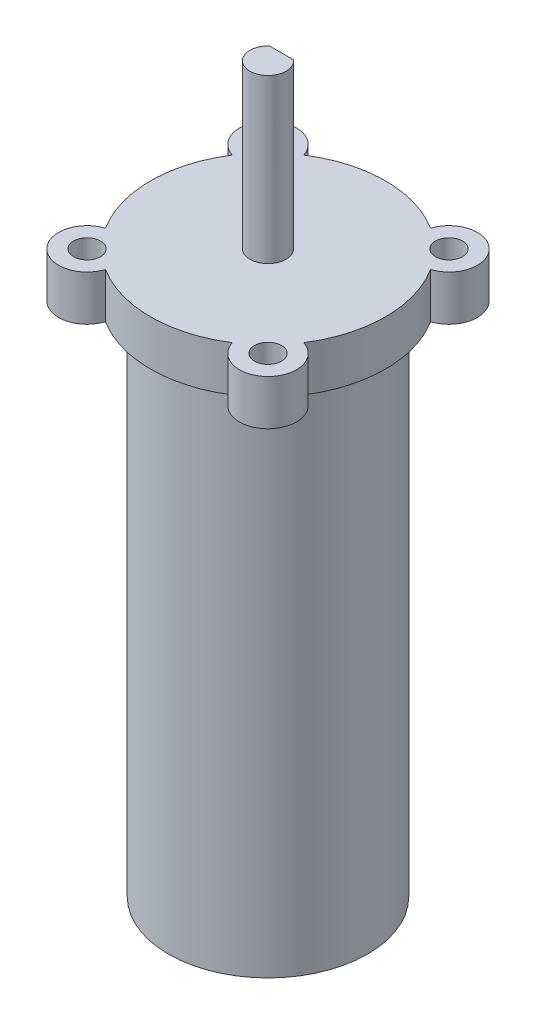
ISO-10303-21;
HEADER;
FILE_DESCRIPTION(('STEP AP214'),'2;1');
FILE_NAME('part.step','',(''),(''),'','','');
FILE_SCHEMA(('AUTOMOTIVE_DESIGN { 1 0 10303 214 1 1 1 1 }'));
ENDSEC;
DATA;
#1=APPLICATION_CONTEXT('core data for automotive mechanical design processes');
#2=APPLICATION_PROTOCOL_DEFINITION('international standard','automotive_design',2000,#1);
#3=PRODUCT_CONTEXT('',#1,'mechanical');
#4=PRODUCT('Part','Part','',(#3));
#5=PRODUCT_RELATED_PRODUCT_CATEGORY('part','',(#4));
#6=PRODUCT_DEFINITION_FORMATION('','',#4);
#7=PRODUCT_DEFINITION_CONTEXT('part definition',#1,'design');
#8=PRODUCT_DEFINITION('design','',#6,#7);
#9=PRODUCT_DEFINITION_SHAPE('','',#8);
#10=(LENGTH_UNIT() NAMED_UNIT(*) SI_UNIT(.MILLI.,.METRE.));
#11=(NAMED_UNIT(*) PLANE_ANGLE_UNIT() SI_UNIT($,.RADIAN.));
#12=(NAMED_UNIT(*) SI_UNIT($,.STERADIAN.) SOLID_ANGLE_UNIT());
#13=UNCERTAINTY_MEASURE_WITH_UNIT(LENGTH_MEASURE(1.E-05),#10,'distance_accuracy_value','');
#14=(GEOMETRIC_REPRESENTATION_CONTEXT(3) GLOBAL_UNCERTAINTY_ASSIGNED_CONTEXT((#13)) GLOBAL_UNIT_ASSIGNED_CONTEXT((#10,
#11,#12)) REPRESENTATION_CONTEXT('',''));
#15=CARTESIAN_POINT('',(0.,0.,0.));
#16=DIRECTION('',(0.,0.,1.));
#17=DIRECTION('',(1.,0.,0.));
#18=AXIS2_PLACEMENT_3D('',#15,#16,#17);
#19=CARTESIAN_POINT('',(0.,62.,0.));
#20=DIRECTION('',(0.,1.,0.));
#21=DIRECTION('',(0.,0.,1.));
#22=AXIS2_PLACEMENT_3D('',#19,#20,#21);
#23=PLANE('',#22);
#24=CARTESIAN_POINT('',(0.,62.,0.));
#25=DIRECTION('',(0.,1.,0.));
#26=DIRECTION('',(0.,0.,1.));
#27=AXIS2_PLACEMENT_3D('',#24,#25,#26);
#28=CIRCLE('',#27,2.);
#29=CARTESIAN_POINT('',(0.,62.,2.));
#30=VERTEX_POINT('',#29);
#31=EDGE_CURVE('E49',#30,#30,#28,.T.);
#32=ORIENTED_EDGE('',*,*,#31,.F.);
#33=EDGE_LOOP('',(#32));
#34=FACE_BOUND('',#33,.T.);
#35=CARTESIAN_POINT('',(0.,62.,0.));
#36=DIRECTION('',(0.,1.,0.));
#37=DIRECTION('',(0.,0.,1.));
#38=AXIS2_PLACEMENT_3D('',#35,#36,#37);
#39=CIRCLE('',#38,13.);
#40=CARTESIAN_POINT('',(-7.00526279150712,62.,-10.9510863945969));
#41=VERTEX_POINT('',#40);
#42=CARTESIAN_POINT('',(7.00526279150712,62.,-10.9510863945969));
#43=VERTEX_POINT('',#42);
#44=EDGE_CURVE('E167',#41,#43,#39,.F.);
#45=ORIENTED_EDGE('',*,*,#44,.F.);
#46=CARTESIAN_POINT('',(-10.,62.,-10.));
#47=DIRECTION('',(0.,1.,0.));
#48=DIRECTION('',(0.,0.,1.));
#49=AXIS2_PLACEMENT_3D('',#46,#47,#48);
#50=CIRCLE('',#49,3.14213562373095);
#51=CARTESIAN_POINT('',(-10.9510863945969,62.,-7.00526279150712));
#52=VERTEX_POINT('',#51);
#53=EDGE_CURVE('E188',#52,#41,#50,.F.);
#54=ORIENTED_EDGE('',*,*,#53,.F.);
#55=CARTESIAN_POINT('',(0.,62.,0.));
#56=DIRECTION('',(0.,1.,0.));
#57=DIRECTION('',(0.,0.,1.));
#58=AXIS2_PLACEMENT_3D('',#55,#56,#57);
#59=CIRCLE('',#58,13.);
#60=CARTESIAN_POINT('',(-10.9510863945969,62.,7.00526279150712));
#61=VERTEX_POINT('',#60);
#62=EDGE_CURVE('E192',#61,#52,#59,.F.);
#63=ORIENTED_EDGE('',*,*,#62,.F.);
#64=CARTESIAN_POINT('',(-10.,62.,9.99999999999999));
#65=DIRECTION('',(0.,1.,0.));
#66=DIRECTION('',(0.,0.,1.));
#67=AXIS2_PLACEMENT_3D('',#64,#65,#66);
#68=CIRCLE('',#67,3.14213562373094);
#69=CARTESIAN_POINT('',(-7.00526279150713,62.,10.9510863945969));
#70=VERTEX_POINT('',#69);
#71=EDGE_CURVE('E196',#70,#61,#68,.F.);
#72=ORIENTED_EDGE('',*,*,#71,.F.);
#73=CARTESIAN_POINT('',(0.,62.,0.));
#74=DIRECTION('',(0.,1.,0.));
#75=DIRECTION('',(0.,0.,1.));
#76=AXIS2_PLACEMENT_3D('',#73,#74,#75);
#77=CIRCLE('',#76,13.);
#78=CARTESIAN_POINT('',(7.00526279150713,62.,10.9510863945969));
#79=VERTEX_POINT('',#78);
#80=EDGE_CURVE('E200',#79,#70,#77,.F.);
#81=ORIENTED_EDGE('',*,*,#80,.F.);
#82=CARTESIAN_POINT('',(10.,62.,10.));
#83=DIRECTION('',(0.,1.,0.));
#84=DIRECTION('',(0.,0.,1.));
#85=AXIS2_PLACEMENT_3D('',#82,#83,#84);
#86=CIRCLE('',#85,3.14213562373095);
#87=CARTESIAN_POINT('',(10.9510863945969,62.,7.00526279150712));
#88=VERTEX_POINT('',#87);
#89=EDGE_CURVE('E204',#88,#79,#86,.F.);
#90=ORIENTED_EDGE('',*,*,#89,.F.);
#91=CARTESIAN_POINT('',(0.,62.,0.));
#92=DIRECTION('',(0.,1.,0.));
#93=DIRECTION('',(0.,0.,1.));
#94=AXIS2_PLACEMENT_3D('',#91,#92,#93);
#95=CIRCLE('',#94,13.);
#96=CARTESIAN_POINT('',(10.9510863945969,62.,-7.00526279150712));
#97=VERTEX_POINT('',#96);
#98=EDGE_CURVE('E208',#97,#88,#95,.F.);
#99=ORIENTED_EDGE('',*,*,#98,.F.);
#100=CARTESIAN_POINT('',(10.,62.,-10.));
#101=DIRECTION('',(0.,1.,0.));
#102=DIRECTION('',(0.,0.,1.));
#103=AXIS2_PLACEMENT_3D('',#100,#101,#102);
#104=CIRCLE('',#103,3.14213562373096);
#105=EDGE_CURVE('E181',#43,#97,#104,.F.);
#106=ORIENTED_EDGE('',*,*,#105,.F.);
#107=EDGE_LOOP('',(#45,#54,#63,#72,#81,#90,#99,#106));
#108=FACE_BOUND('',#107,.T.);
#109=CARTESIAN_POINT('',(10.,62.,10.));
#110=DIRECTION('',(0.,1.,0.));
#111=DIRECTION('',(0.,0.,1.));
#112=AXIS2_PLACEMENT_3D('',#109,#110,#111);
#113=CIRCLE('',#112,1.5);
#114=CARTESIAN_POINT('',(10.,62.,11.5));
#115=VERTEX_POINT('',#114);
#116=EDGE_CURVE('E177',#115,#115,#113,.F.);
#117=ORIENTED_EDGE('',*,*,#116,.T.);
#118=EDGE_LOOP('',(#117));
#119=FACE_BOUND('',#118,.T.);
#120=CARTESIAN_POINT('',(-10.,62.,-10.));
#121=DIRECTION('',(0.,1.,0.));
#122=DIRECTION('',(0.,0.,1.));
#123=AXIS2_PLACEMENT_3D('',#120,#121,#122);
#124=CIRCLE('',#123,1.5);
#125=CARTESIAN_POINT('',(-10.,62.,-8.5));
#126=VERTEX_POINT('',#125);
#127=EDGE_CURVE('E174',#126,#126,#124,.F.);
#128=ORIENTED_EDGE('',*,*,#127,.T.);
#129=EDGE_LOOP('',(#128));
#130=FACE_BOUND('',#129,.T.);
#131=CARTESIAN_POINT('',(-10.,62.,9.99999999999999));
#132=DIRECTION('',(0.,1.,0.));
#133=DIRECTION('',(0.,0.,1.));
#134=AXIS2_PLACEMENT_3D('',#131,#132,#133);
#135=CIRCLE('',#134,1.5);
#136=CARTESIAN_POINT('',(-10.,62.,11.5));
#137=VERTEX_POINT('',#136);
#138=EDGE_CURVE('E171',#137,#137,#135,.F.);
#139=ORIENTED_EDGE('',*,*,#138,.T.);
#140=EDGE_LOOP('',(#139));
#141=FACE_BOUND('',#140,.T.);
#142=CARTESIAN_POINT('',(10.,62.,-10.));
#143=DIRECTION('',(0.,1.,0.));
#144=DIRECTION('',(0.,0.,1.));
#145=AXIS2_PLACEMENT_3D('',#142,#143,#144);
#146=CIRCLE('',#145,1.5);
#147=CARTESIAN_POINT('',(10.,62.,-8.5));
#148=VERTEX_POINT('',#147);
#149=EDGE_CURVE('E168',#148,#148,#146,.F.);
#150=ORIENTED_EDGE('',*,*,#149,.T.);
#151=EDGE_LOOP('',(#150));
#152=FACE_BOUND('',#151,.T.);
#153=ADVANCED_FACE('F40',(#34,#108,#119,#130,#141,#152),#23,.T.);
#154=CARTESIAN_POINT('',(0.,80.,0.));
#155=DIRECTION('',(0.,-1.,0.));
#156=DIRECTION('',(0.,0.,-1.));
#157=AXIS2_PLACEMENT_3D('',#154,#155,#156);
#158=CYLINDRICAL_SURFACE('',#157,2.);
#159=CARTESIAN_POINT('',(0.,80.,0.));
#160=DIRECTION('',(0.,1.,0.));
#161=DIRECTION('',(0.,0.,1.));
#162=AXIS2_PLACEMENT_3D('',#159,#160,#161);
#163=CIRCLE('',#162,2.);
#164=CARTESIAN_POINT('',(-1.3228756555323,80.,-1.5));
#165=VERTEX_POINT('',#164);
#166=CARTESIAN_POINT('',(1.3228756555323,80.,-1.5));
#167=VERTEX_POINT('',#166);
#168=EDGE_CURVE('E12',#165,#167,#163,.T.);
#169=ORIENTED_EDGE('',*,*,#168,.F.);
#170=DIRECTION('',(0.,1.,0.));
#171=VECTOR('',#170,1.);
#172=CARTESIAN_POINT('',(-1.3228756555323,68.,-1.5));
#173=LINE('',#172,#171);
#174=CARTESIAN_POINT('',(-1.3228756555323,68.,-1.5));
#175=VERTEX_POINT('',#174);
#176=EDGE_CURVE('E57',#175,#165,#173,.T.);
#177=ORIENTED_EDGE('',*,*,#176,.F.);
#178=CARTESIAN_POINT('',(0.,68.,0.));
#179=DIRECTION('',(0.,1.,0.));
#180=DIRECTION('',(0.,0.,1.));
#181=AXIS2_PLACEMENT_3D('',#178,#179,#180);
#182=CIRCLE('',#181,2.);
#183=CARTESIAN_POINT('',(1.3228756555323,68.,-1.5));
#184=VERTEX_POINT('',#183);
#185=EDGE_CURVE('E120',#184,#175,#182,.T.);
#186=ORIENTED_EDGE('',*,*,#185,.F.);
#187=DIRECTION('',(0.,1.,0.));
#188=VECTOR('',#187,1.);
#189=CARTESIAN_POINT('',(1.3228756555323,68.,-1.5));
#190=LINE('',#189,#188);
#191=EDGE_CURVE('E128',#184,#167,#190,.T.);
#192=ORIENTED_EDGE('',*,*,#191,.T.);
#193=EDGE_LOOP('',(#169,#177,#186,#192));
#194=FACE_BOUND('',#193,.T.);
#195=ORIENTED_EDGE('',*,*,#31,.T.);
#196=EDGE_LOOP('',(#195));
#197=FACE_BOUND('',#196,.T.);
#198=ADVANCED_FACE('F131',(#194,#197),#158,.T.);
#199=CARTESIAN_POINT('',(0.,80.,0.));
#200=DIRECTION('',(0.,1.,0.));
#201=DIRECTION('',(0.,0.,1.));
#202=AXIS2_PLACEMENT_3D('',#199,#200,#201);
#203=PLANE('',#202);
#204=DIRECTION('',(1.,0.,0.));
#205=VECTOR('',#204,1.);
#206=CARTESIAN_POINT('',(-1.3228756555323,80.,-1.5));
#207=LINE('',#206,#205);
#208=EDGE_CURVE('E125',#165,#167,#207,.T.);
#209=ORIENTED_EDGE('',*,*,#208,.F.);
#210=ORIENTED_EDGE('',*,*,#168,.T.);
#211=EDGE_LOOP('',(#209,#210));
#212=FACE_BOUND('',#211,.T.);
#213=ADVANCED_FACE('F269',(#212),#203,.T.);
#214=CARTESIAN_POINT('',(0.,99.1715728752538,0.));
#215=DIRECTION('',(0.,-1.,0.));
#216=DIRECTION('',(0.,0.,-1.));
#217=AXIS2_PLACEMENT_3D('',#214,#215,#216);
#218=CYLINDRICAL_SURFACE('',#217,13.);
#219=CARTESIAN_POINT('',(0.,57.,0.));
#220=DIRECTION('',(0.,1.,0.));
#221=DIRECTION('',(0.,0.,1.));
#222=AXIS2_PLACEMENT_3D('',#219,#220,#221);
#223=CIRCLE('',#222,13.);
#224=CARTESIAN_POINT('',(-7.00526279150712,57.,-10.9510863945969));
#225=VERTEX_POINT('',#224);
#226=CARTESIAN_POINT('',(7.00526279150712,57.,-10.9510863945969));
#227=VERTEX_POINT('',#226);
#228=EDGE_CURVE('E65',#225,#227,#223,.F.);
#229=ORIENTED_EDGE('',*,*,#228,.F.);
#230=DIRECTION('',(0.,-1.,0.));
#231=VECTOR('',#230,1.);
#232=CARTESIAN_POINT('',(-7.00526279150712,99.1715728752538,-10.9510863945969));
#233=LINE('',#232,#231);
#234=EDGE_CURVE('E191',#41,#225,#233,.T.);
#235=ORIENTED_EDGE('',*,*,#234,.F.);
#236=ORIENTED_EDGE('',*,*,#44,.T.);
#237=DIRECTION('',(0.,-1.,0.));
#238=VECTOR('',#237,1.);
#239=CARTESIAN_POINT('',(7.00526279150712,99.1715728752538,-10.9510863945969));
#240=LINE('',#239,#238);
#241=EDGE_CURVE('E187',#43,#227,#240,.T.);
#242=ORIENTED_EDGE('',*,*,#241,.T.);
#243=EDGE_LOOP('',(#229,#235,#236,#242));
#244=FACE_BOUND('',#243,.T.);
#245=ADVANCED_FACE('F258',(#244),#218,.T.);
#246=CARTESIAN_POINT('',(-10.,99.1715728752538,-10.));
#247=DIRECTION('',(0.,-1.,0.));
#248=DIRECTION('',(0.,0.,-1.));
#249=AXIS2_PLACEMENT_3D('',#246,#247,#248);
#250=CYLINDRICAL_SURFACE('',#249,3.14213562373095);
#251=CARTESIAN_POINT('',(-10.,57.,-10.));
#252=DIRECTION('',(0.,1.,0.));
#253=DIRECTION('',(0.,0.,1.));
#254=AXIS2_PLACEMENT_3D('',#251,#252,#253);
#255=CIRCLE('',#254,3.14213562373095);
#256=CARTESIAN_POINT('',(-10.9510863945969,57.,-7.00526279150712));
#257=VERTEX_POINT('',#256);
#258=EDGE_CURVE('E164',#257,#225,#255,.F.);
#259=ORIENTED_EDGE('',*,*,#258,.F.);
#260=DIRECTION('',(0.,-1.,0.));
#261=VECTOR('',#260,1.);
#262=CARTESIAN_POINT('',(-10.9510863945969,99.1715728752538,-7.00526279150712));
#263=LINE('',#262,#261);
#264=EDGE_CURVE('E195',#52,#257,#263,.T.);
#265=ORIENTED_EDGE('',*,*,#264,.F.);
#266=ORIENTED_EDGE('',*,*,#53,.T.);
#267=ORIENTED_EDGE('',*,*,#234,.T.);
#268=EDGE_LOOP('',(#259,#265,#266,#267));
#269=FACE_BOUND('',#268,.T.);
#270=ADVANCED_FACE('F290',(#269),#250,.T.);
#271=CARTESIAN_POINT('',(0.,99.1715728752538,0.));
#272=DIRECTION('',(0.,-1.,0.));
#273=DIRECTION('',(0.,0.,-1.));
#274=AXIS2_PLACEMENT_3D('',#271,#272,#273);
#275=CYLINDRICAL_SURFACE('',#274,13.);
#276=CARTESIAN_POINT('',(0.,57.,0.));
#277=DIRECTION('',(0.,1.,0.));
#278=DIRECTION('',(0.,0.,1.));
#279=AXIS2_PLACEMENT_3D('',#276,#277,#278);
#280=CIRCLE('',#279,13.);
#281=CARTESIAN_POINT('',(-10.9510863945969,57.,7.00526279150712));
#282=VERTEX_POINT('',#281);
#283=EDGE_CURVE('E162',#282,#257,#280,.F.);
#284=ORIENTED_EDGE('',*,*,#283,.F.);
#285=DIRECTION('',(0.,-1.,0.));
#286=VECTOR('',#285,1.);
#287=CARTESIAN_POINT('',(-10.9510863945969,99.1715728752538,7.00526279150712));
#288=LINE('',#287,#286);
#289=EDGE_CURVE('E199',#61,#282,#288,.T.);
#290=ORIENTED_EDGE('',*,*,#289,.F.);
#291=ORIENTED_EDGE('',*,*,#62,.T.);
#292=ORIENTED_EDGE('',*,*,#264,.T.);
#293=EDGE_LOOP('',(#284,#290,#291,#292));
#294=FACE_BOUND('',#293,.T.);
#295=ADVANCED_FACE('F297',(#294),#275,.T.);
#296=CARTESIAN_POINT('',(-10.,99.1715728752538,9.99999999999999));
#297=DIRECTION('',(0.,-1.,0.));
#298=DIRECTION('',(0.,0.,-1.));
#299=AXIS2_PLACEMENT_3D('',#296,#297,#298);
#300=CYLINDRICAL_SURFACE('',#299,3.14213562373094);
#301=CARTESIAN_POINT('',(-10.,57.,9.99999999999999));
#302=DIRECTION('',(0.,1.,0.));
#303=DIRECTION('',(0.,0.,1.));
#304=AXIS2_PLACEMENT_3D('',#301,#302,#303);
#305=CIRCLE('',#304,3.14213562373094);
#306=CARTESIAN_POINT('',(-7.00526279150713,57.,10.9510863945969));
#307=VERTEX_POINT('',#306);
#308=EDGE_CURVE('E160',#307,#282,#305,.F.);
#309=ORIENTED_EDGE('',*,*,#308,.F.);
#310=DIRECTION('',(0.,-1.,0.));
#311=VECTOR('',#310,1.);
#312=CARTESIAN_POINT('',(-7.00526279150713,99.1715728752538,10.9510863945969));
#313=LINE('',#312,#311);
#314=EDGE_CURVE('E203',#70,#307,#313,.T.);
#315=ORIENTED_EDGE('',*,*,#314,.F.);
#316=ORIENTED_EDGE('',*,*,#71,.T.);
#317=ORIENTED_EDGE('',*,*,#289,.T.);
#318=EDGE_LOOP('',(#309,#315,#316,#317));
#319=FACE_BOUND('',#318,.T.);
#320=ADVANCED_FACE('F304',(#319),#300,.T.);
#321=CARTESIAN_POINT('',(0.,99.1715728752538,0.));
#322=DIRECTION('',(0.,-1.,0.));
#323=DIRECTION('',(0.,0.,-1.));
#324=AXIS2_PLACEMENT_3D('',#321,#322,#323);
#325=CYLINDRICAL_SURFACE('',#324,13.);
#326=CARTESIAN_POINT('',(0.,57.,0.));
#327=DIRECTION('',(0.,1.,0.));
#328=DIRECTION('',(0.,0.,1.));
#329=AXIS2_PLACEMENT_3D('',#326,#327,#328);
#330=CIRCLE('',#329,13.);
#331=CARTESIAN_POINT('',(7.00526279150713,57.,10.9510863945969));
#332=VERTEX_POINT('',#331);
#333=EDGE_CURVE('E158',#332,#307,#330,.F.);
#334=ORIENTED_EDGE('',*,*,#333,.F.);
#335=DIRECTION('',(0.,-1.,0.));
#336=VECTOR('',#335,1.);
#337=CARTESIAN_POINT('',(7.00526279150713,99.1715728752538,10.9510863945969));
#338=LINE('',#337,#336);
#339=EDGE_CURVE('E207',#79,#332,#338,.T.);
#340=ORIENTED_EDGE('',*,*,#339,.F.);
#341=ORIENTED_EDGE('',*,*,#80,.T.);
#342=ORIENTED_EDGE('',*,*,#314,.T.);
#343=EDGE_LOOP('',(#334,#340,#341,#342));
#344=FACE_BOUND('',#343,.T.);
#345=ADVANCED_FACE('F312',(#344),#325,.T.);
#346=CARTESIAN_POINT('',(10.,99.1715728752538,10.));
#347=DIRECTION('',(0.,-1.,0.));
#348=DIRECTION('',(0.,0.,-1.));
#349=AXIS2_PLACEMENT_3D('',#346,#347,#348);
#350=CYLINDRICAL_SURFACE('',#349,3.14213562373095);
#351=CARTESIAN_POINT('',(10.,57.,10.));
#352=DIRECTION('',(0.,1.,0.));
#353=DIRECTION('',(0.,0.,1.));
#354=AXIS2_PLACEMENT_3D('',#351,#352,#353);
#355=CIRCLE('',#354,3.14213562373095);
#356=CARTESIAN_POINT('',(10.9510863945969,57.,7.00526279150712));
#357=VERTEX_POINT('',#356);
#358=EDGE_CURVE('E156',#357,#332,#355,.F.);
#359=ORIENTED_EDGE('',*,*,#358,.F.);
#360=DIRECTION('',(0.,-1.,0.));
#361=VECTOR('',#360,1.);
#362=CARTESIAN_POINT('',(10.9510863945969,99.1715728752538,7.00526279150712));
#363=LINE('',#362,#361);
#364=EDGE_CURVE('E184',#88,#357,#363,.T.);
#365=ORIENTED_EDGE('',*,*,#364,.F.);
#366=ORIENTED_EDGE('',*,*,#89,.T.);
#367=ORIENTED_EDGE('',*,*,#339,.T.);
#368=EDGE_LOOP('',(#359,#365,#366,#367));
#369=FACE_BOUND('',#368,.T.);
#370=ADVANCED_FACE('F320',(#369),#350,.T.);
#371=CARTESIAN_POINT('',(0.,99.1715728752538,0.));
#372=DIRECTION('',(0.,-1.,0.));
#373=DIRECTION('',(0.,0.,-1.));
#374=AXIS2_PLACEMENT_3D('',#371,#372,#373);
#375=CYLINDRICAL_SURFACE('',#374,13.);
#376=CARTESIAN_POINT('',(0.,57.,0.));
#377=DIRECTION('',(0.,1.,0.));
#378=DIRECTION('',(0.,0.,1.));
#379=AXIS2_PLACEMENT_3D('',#376,#377,#378);
#380=CIRCLE('',#379,13.);
#381=CARTESIAN_POINT('',(10.9510863945969,57.,-7.00526279150712));
#382=VERTEX_POINT('',#381);
#383=EDGE_CURVE('E154',#382,#357,#380,.F.);
#384=ORIENTED_EDGE('',*,*,#383,.F.);
#385=DIRECTION('',(0.,-1.,0.));
#386=VECTOR('',#385,1.);
#387=CARTESIAN_POINT('',(10.9510863945969,99.1715728752538,-7.00526279150712));
#388=LINE('',#387,#386);
#389=EDGE_CURVE('E180',#97,#382,#388,.T.);
#390=ORIENTED_EDGE('',*,*,#389,.F.);
#391=ORIENTED_EDGE('',*,*,#98,.T.);
#392=ORIENTED_EDGE('',*,*,#364,.T.);
#393=EDGE_LOOP('',(#384,#390,#391,#392));
#394=FACE_BOUND('',#393,.T.);
#395=ADVANCED_FACE('F254',(#394),#375,.T.);
#396=CARTESIAN_POINT('',(10.,99.1715728752538,-10.));
#397=DIRECTION('',(0.,-1.,0.));
#398=DIRECTION('',(0.,0.,-1.));
#399=AXIS2_PLACEMENT_3D('',#396,#397,#398);
#400=CYLINDRICAL_SURFACE('',#399,3.14213562373096);
#401=CARTESIAN_POINT('',(10.,57.,-10.));
#402=DIRECTION('',(0.,1.,0.));
#403=DIRECTION('',(0.,0.,1.));
#404=AXIS2_PLACEMENT_3D('',#401,#402,#403);
#405=CIRCLE('',#404,3.14213562373096);
#406=EDGE_CURVE('E152',#227,#382,#405,.F.);
#407=ORIENTED_EDGE('',*,*,#406,.F.);
#408=ORIENTED_EDGE('',*,*,#241,.F.);
#409=ORIENTED_EDGE('',*,*,#105,.T.);
#410=ORIENTED_EDGE('',*,*,#389,.T.);
#411=EDGE_LOOP('',(#407,#408,#409,#410));
#412=FACE_BOUND('',#411,.T.);
#413=ADVANCED_FACE('F244',(#412),#400,.T.);
#414=CARTESIAN_POINT('',(10.,99.1715728752538,-10.));
#415=DIRECTION('',(0.,-1.,0.));
#416=DIRECTION('',(0.,0.,-1.));
#417=AXIS2_PLACEMENT_3D('',#414,#415,#416);
#418=CYLINDRICAL_SURFACE('',#417,1.5);
#419=CARTESIAN_POINT('',(10.,57.,-10.));
#420=DIRECTION('',(0.,1.,0.));
#421=DIRECTION('',(0.,0.,1.));
#422=AXIS2_PLACEMENT_3D('',#419,#420,#421);
#423=CIRCLE('',#422,1.5);
#424=CARTESIAN_POINT('',(10.,57.,-8.5));
#425=VERTEX_POINT('',#424);
#426=EDGE_CURVE('E149',#425,#425,#423,.F.);
#427=ORIENTED_EDGE('',*,*,#426,.T.);
#428=EDGE_LOOP('',(#427));
#429=FACE_BOUND('',#428,.T.);
#430=ORIENTED_EDGE('',*,*,#149,.F.);
#431=EDGE_LOOP('',(#430));
#432=FACE_BOUND('',#431,.T.);
#433=ADVANCED_FACE('F241',(#429,#432),#418,.F.);
#434=CARTESIAN_POINT('',(10.,99.1715728752538,10.));
#435=DIRECTION('',(0.,-1.,0.));
#436=DIRECTION('',(0.,0.,-1.));
#437=AXIS2_PLACEMENT_3D('',#434,#435,#436);
#438=CYLINDRICAL_SURFACE('',#437,1.5);
#439=CARTESIAN_POINT('',(10.,57.,10.));
#440=DIRECTION('',(0.,1.,0.));
#441=DIRECTION('',(0.,0.,1.));
#442=AXIS2_PLACEMENT_3D('',#439,#440,#441);
#443=CIRCLE('',#442,1.5);
#444=CARTESIAN_POINT('',(10.,57.,11.5));
#445=VERTEX_POINT('',#444);
#446=EDGE_CURVE('E146',#445,#445,#443,.F.);
#447=ORIENTED_EDGE('',*,*,#446,.T.);
#448=EDGE_LOOP('',(#447));
#449=FACE_BOUND('',#448,.T.);
#450=ORIENTED_EDGE('',*,*,#116,.F.);
#451=EDGE_LOOP('',(#450));
#452=FACE_BOUND('',#451,.T.);
#453=ADVANCED_FACE('F243',(#449,#452),#438,.F.);
#454=CARTESIAN_POINT('',(-10.,99.1715728752538,9.99999999999999));
#455=DIRECTION('',(0.,-1.,0.));
#456=DIRECTION('',(0.,0.,-1.));
#457=AXIS2_PLACEMENT_3D('',#454,#455,#456);
#458=CYLINDRICAL_SURFACE('',#457,1.5);
#459=CARTESIAN_POINT('',(-10.,57.,9.99999999999999));
#460=DIRECTION('',(0.,1.,0.));
#461=DIRECTION('',(0.,0.,1.));
#462=AXIS2_PLACEMENT_3D('',#459,#460,#461);
#463=CIRCLE('',#462,1.5);
#464=CARTESIAN_POINT('',(-10.,57.,11.5));
#465=VERTEX_POINT('',#464);
#466=EDGE_CURVE('E143',#465,#465,#463,.F.);
#467=ORIENTED_EDGE('',*,*,#466,.T.);
#468=EDGE_LOOP('',(#467));
#469=FACE_BOUND('',#468,.T.);
#470=ORIENTED_EDGE('',*,*,#138,.F.);
#471=EDGE_LOOP('',(#470));
#472=FACE_BOUND('',#471,.T.);
#473=ADVANCED_FACE('F251',(#469,#472),#458,.F.);
#474=CARTESIAN_POINT('',(-10.,99.1715728752538,-10.));
#475=DIRECTION('',(0.,-1.,0.));
#476=DIRECTION('',(0.,0.,-1.));
#477=AXIS2_PLACEMENT_3D('',#474,#475,#476);
#478=CYLINDRICAL_SURFACE('',#477,1.5);
#479=CARTESIAN_POINT('',(-10.,57.,-10.));
#480=DIRECTION('',(0.,1.,0.));
#481=DIRECTION('',(0.,0.,1.));
#482=AXIS2_PLACEMENT_3D('',#479,#480,#481);
#483=CIRCLE('',#482,1.5);
#484=CARTESIAN_POINT('',(-10.,57.,-8.5));
#485=VERTEX_POINT('',#484);
#486=EDGE_CURVE('E44',#485,#485,#483,.F.);
#487=ORIENTED_EDGE('',*,*,#486,.T.);
#488=EDGE_LOOP('',(#487));
#489=FACE_BOUND('',#488,.T.);
#490=ORIENTED_EDGE('',*,*,#127,.F.);
#491=EDGE_LOOP('',(#490));
#492=FACE_BOUND('',#491,.T.);
#493=ADVANCED_FACE('F263',(#489,#492),#478,.F.);
#494=CARTESIAN_POINT('',(0.,57.,0.));
#495=DIRECTION('',(0.,1.,0.));
#496=DIRECTION('',(0.,0.,1.));
#497=AXIS2_PLACEMENT_3D('',#494,#495,#496);
#498=PLANE('',#497);
#499=ORIENTED_EDGE('',*,*,#228,.T.);
#500=ORIENTED_EDGE('',*,*,#406,.T.);
#501=ORIENTED_EDGE('',*,*,#383,.T.);
#502=ORIENTED_EDGE('',*,*,#358,.T.);
#503=ORIENTED_EDGE('',*,*,#333,.T.);
#504=ORIENTED_EDGE('',*,*,#308,.T.);
#505=ORIENTED_EDGE('',*,*,#283,.T.);
#506=ORIENTED_EDGE('',*,*,#258,.T.);
#507=EDGE_LOOP('',(#499,#500,#501,#502,#503,#504,#505,#506));
#508=FACE_BOUND('',#507,.T.);
#509=ORIENTED_EDGE('',*,*,#446,.F.);
#510=EDGE_LOOP('',(#509));
#511=FACE_BOUND('',#510,.T.);
#512=ORIENTED_EDGE('',*,*,#486,.F.);
#513=EDGE_LOOP('',(#512));
#514=FACE_BOUND('',#513,.T.);
#515=CARTESIAN_POINT('',(0.,57.,0.));
#516=DIRECTION('',(0.,1.,0.));
#517=DIRECTION('',(0.,0.,1.));
#518=AXIS2_PLACEMENT_3D('',#515,#516,#517);
#519=CIRCLE('',#518,11.);
#520=CARTESIAN_POINT('',(0.,57.,11.));
#521=VERTEX_POINT('',#520);
#522=EDGE_CURVE('E140',#521,#521,#519,.F.);
#523=ORIENTED_EDGE('',*,*,#522,.F.);
#524=EDGE_LOOP('',(#523));
#525=FACE_BOUND('',#524,.T.);
#526=ORIENTED_EDGE('',*,*,#466,.F.);
#527=EDGE_LOOP('',(#526));
#528=FACE_BOUND('',#527,.T.);
#529=ORIENTED_EDGE('',*,*,#426,.F.);
#530=EDGE_LOOP('',(#529));
#531=FACE_BOUND('',#530,.T.);
#532=ADVANCED_FACE('F267',(#508,#511,#514,#525,#528,#531),#498,.F.);
#533=CARTESIAN_POINT('',(0.,121.174199093839,0.));
#534=DIRECTION('',(0.,-1.,0.));
#535=DIRECTION('',(0.,0.,-1.));
#536=AXIS2_PLACEMENT_3D('',#533,#534,#535);
#537=CYLINDRICAL_SURFACE('',#536,11.);
#538=CARTESIAN_POINT('',(0.,0.,0.));
#539=DIRECTION('',(0.,-1.,0.));
#540=DIRECTION('',(0.,0.,-1.));
#541=AXIS2_PLACEMENT_3D('',#538,#539,#540);
#542=CIRCLE('',#541,11.);
#543=CARTESIAN_POINT('',(0.,0.,-11.));
#544=VERTEX_POINT('',#543);
#545=EDGE_CURVE('E134',#544,#544,#542,.T.);
#546=ORIENTED_EDGE('',*,*,#545,.F.);
#547=EDGE_LOOP('',(#546));
#548=FACE_BOUND('',#547,.T.);
#549=ORIENTED_EDGE('',*,*,#522,.T.);
#550=EDGE_LOOP('',(#549));
#551=FACE_BOUND('',#550,.T.);
#552=ADVANCED_FACE('F372',(#548,#551),#537,.T.);
#553=CARTESIAN_POINT('',(0.,0.,0.));
#554=DIRECTION('',(0.,1.,0.));
#555=DIRECTION('',(0.,0.,1.));
#556=AXIS2_PLACEMENT_3D('',#553,#554,#555);
#557=PLANE('',#556);
#558=ORIENTED_EDGE('',*,*,#545,.T.);
#559=EDGE_LOOP('',(#558));
#560=FACE_BOUND('',#559,.T.);
#561=ADVANCED_FACE('F42',(#560),#557,.F.);
#562=CARTESIAN_POINT('',(-1.3228756555323,68.,-1.5));
#563=DIRECTION('',(0.,0.,1.));
#564=DIRECTION('',(1.,0.,0.));
#565=AXIS2_PLACEMENT_3D('',#562,#563,#564);
#566=PLANE('',#565);
#567=ORIENTED_EDGE('',*,*,#208,.T.);
#568=ORIENTED_EDGE('',*,*,#191,.F.);
#569=DIRECTION('',(1.,0.,0.));
#570=VECTOR('',#569,1.);
#571=CARTESIAN_POINT('',(-1.3228756555323,68.,-1.5));
#572=LINE('',#571,#570);
#573=EDGE_CURVE('E122',#175,#184,#572,.T.);
#574=ORIENTED_EDGE('',*,*,#573,.F.);
#575=ORIENTED_EDGE('',*,*,#176,.T.);
#576=EDGE_LOOP('',(#567,#568,#574,#575));
#577=FACE_BOUND('',#576,.T.);
#578=ADVANCED_FACE('F127',(#577),#566,.F.);
#579=CARTESIAN_POINT('',(0.,68.,0.));
#580=DIRECTION('',(0.,1.,0.));
#581=DIRECTION('',(0.,0.,1.));
#582=AXIS2_PLACEMENT_3D('',#579,#580,#581);
#583=PLANE('',#582);
#584=ORIENTED_EDGE('',*,*,#185,.T.);
#585=ORIENTED_EDGE('',*,*,#573,.T.);
#586=EDGE_LOOP('',(#584,#585));
#587=FACE_BOUND('',#586,.T.);
#588=ADVANCED_FACE('F121',(#587),#583,.T.);
#589=CLOSED_SHELL('',(#153,#198,#213,#245,#270,#295,#320,#345,#370,#395,#413,#433,#453,#473,
#493,#532,#552,#561,#578,#588));
#590=MANIFOLD_SOLID_BREP('B2',#589);
#591=ADVANCED_BREP_SHAPE_REPRESENTATION('',(#18,#590),#14);
#592=SHAPE_DEFINITION_REPRESENTATION(#9,#591);
ENDSEC;
END-ISO-10303-21;
